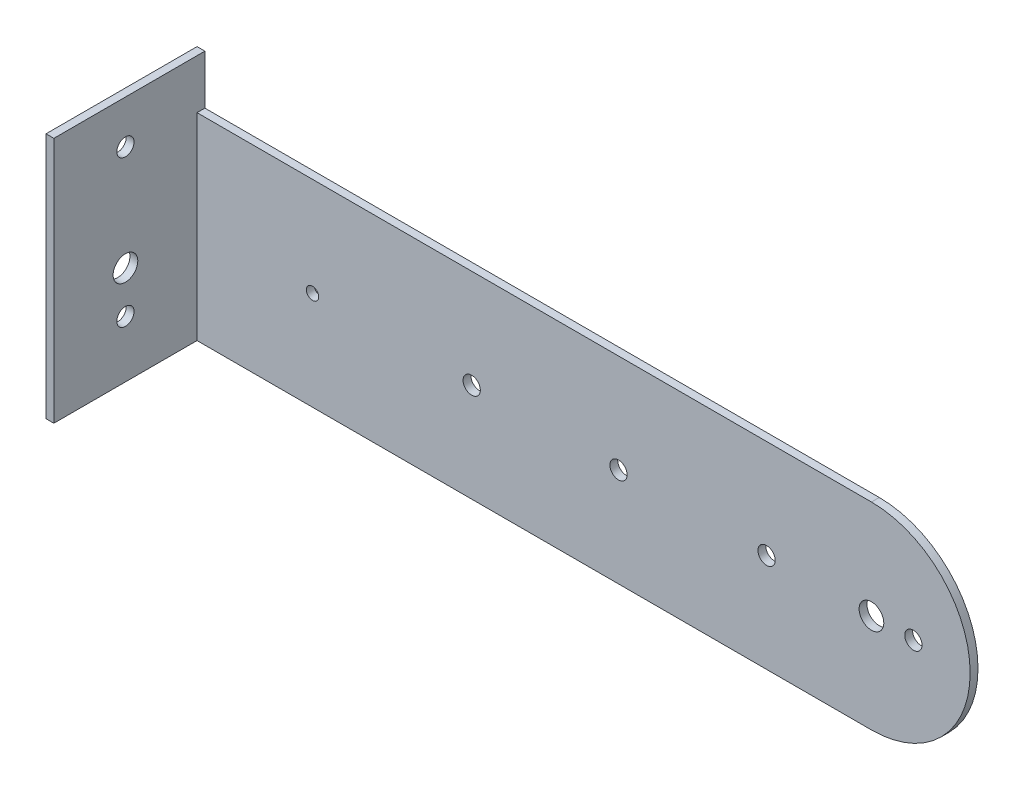
ISO-10303-21;
HEADER;
FILE_DESCRIPTION(('STEP AP214'),'2;1');
FILE_NAME('part.step','',(''),(''),'','','');
FILE_SCHEMA(('AUTOMOTIVE_DESIGN { 1 0 10303 214 1 1 1 1 }'));
ENDSEC;
DATA;
#1=APPLICATION_CONTEXT('core data for automotive mechanical design processes');
#2=APPLICATION_PROTOCOL_DEFINITION('international standard','automotive_design',2000,#1);
#3=PRODUCT_CONTEXT('',#1,'mechanical');
#4=PRODUCT('Part','Part','',(#3));
#5=PRODUCT_RELATED_PRODUCT_CATEGORY('part','',(#4));
#6=PRODUCT_DEFINITION_FORMATION('','',#4);
#7=PRODUCT_DEFINITION_CONTEXT('part definition',#1,'design');
#8=PRODUCT_DEFINITION('design','',#6,#7);
#9=PRODUCT_DEFINITION_SHAPE('','',#8);
#10=(LENGTH_UNIT() NAMED_UNIT(*) SI_UNIT(.MILLI.,.METRE.));
#11=(NAMED_UNIT(*) PLANE_ANGLE_UNIT() SI_UNIT($,.RADIAN.));
#12=(NAMED_UNIT(*) SI_UNIT($,.STERADIAN.) SOLID_ANGLE_UNIT());
#13=UNCERTAINTY_MEASURE_WITH_UNIT(LENGTH_MEASURE(1.E-05),#10,'distance_accuracy_value','');
#14=(GEOMETRIC_REPRESENTATION_CONTEXT(3) GLOBAL_UNCERTAINTY_ASSIGNED_CONTEXT((#13)) GLOBAL_UNIT_ASSIGNED_CONTEXT((#10,
#11,#12)) REPRESENTATION_CONTEXT('',''));
#15=CARTESIAN_POINT('',(0.,0.,0.));
#16=DIRECTION('',(0.,0.,1.));
#17=DIRECTION('',(1.,0.,0.));
#18=AXIS2_PLACEMENT_3D('',#15,#16,#17);
#19=CARTESIAN_POINT('',(-38.5140352366991,20.,1.59));
#20=DIRECTION('',(0.,-1.,0.));
#21=DIRECTION('',(0.,0.,-1.));
#22=AXIS2_PLACEMENT_3D('',#19,#20,#21);
#23=PLANE('',#22);
#24=DIRECTION('',(0.,0.,-1.));
#25=VECTOR('',#24,1.);
#26=CARTESIAN_POINT('',(-98.1399647633009,20.,0.));
#27=LINE('',#26,#25);
#28=CARTESIAN_POINT('',(-98.1399647633009,20.,1.59));
#29=VERTEX_POINT('',#28);
#30=CARTESIAN_POINT('',(-98.1399647633009,20.,0.));
#31=VERTEX_POINT('',#30);
#32=EDGE_CURVE('E99',#29,#31,#27,.T.);
#33=ORIENTED_EDGE('',*,*,#32,.F.);
#34=DIRECTION('',(-1.,0.,0.));
#35=VECTOR('',#34,1.);
#36=CARTESIAN_POINT('',(-38.5140352366991,20.,1.59));
#37=LINE('',#36,#35);
#38=CARTESIAN_POINT('',(38.5140352366991,20.,1.59));
#39=VERTEX_POINT('',#38);
#40=EDGE_CURVE('E164',#39,#29,#37,.T.);
#41=ORIENTED_EDGE('',*,*,#40,.F.);
#42=DIRECTION('',(0.,0.,-1.));
#43=VECTOR('',#42,1.);
#44=CARTESIAN_POINT('',(38.5140352366991,20.,1.59));
#45=LINE('',#44,#43);
#46=CARTESIAN_POINT('',(38.5140352366991,20.,0.));
#47=VERTEX_POINT('',#46);
#48=EDGE_CURVE('E167',#39,#47,#45,.T.);
#49=ORIENTED_EDGE('',*,*,#48,.T.);
#50=DIRECTION('',(-1.,0.,0.));
#51=VECTOR('',#50,1.);
#52=CARTESIAN_POINT('',(-38.5140352366991,20.,0.));
#53=LINE('',#52,#51);
#54=EDGE_CURVE('E162',#47,#31,#53,.T.);
#55=ORIENTED_EDGE('',*,*,#54,.T.);
#56=EDGE_LOOP('',(#33,#41,#49,#55));
#57=FACE_BOUND('',#56,.T.);
#58=ADVANCED_FACE('F33',(#57),#23,.F.);
#59=CARTESIAN_POINT('',(-99.7299647633009,20.,1.59));
#60=DIRECTION('',(1.,0.,0.));
#61=DIRECTION('',(0.,0.,-1.));
#62=AXIS2_PLACEMENT_3D('',#59,#60,#61);
#63=PLANE('',#62);
#64=CARTESIAN_POINT('',(-99.7299647633009,0.,16.096));
#65=DIRECTION('',(-1.,0.,0.));
#66=DIRECTION('',(0.,0.,1.));
#67=AXIS2_PLACEMENT_3D('',#64,#65,#66);
#68=CIRCLE('',#67,2.5);
#69=CARTESIAN_POINT('',(-99.7299647633009,0.,18.596));
#70=VERTEX_POINT('',#69);
#71=EDGE_CURVE('E185',#70,#70,#68,.T.);
#72=ORIENTED_EDGE('',*,*,#71,.F.);
#73=EDGE_LOOP('',(#72));
#74=FACE_BOUND('',#73,.T.);
#75=CARTESIAN_POINT('',(-99.7299647633009,21.25,16.096));
#76=DIRECTION('',(-1.,0.,0.));
#77=DIRECTION('',(0.,0.,1.));
#78=AXIS2_PLACEMENT_3D('',#75,#76,#77);
#79=CIRCLE('',#78,1.75);
#80=CARTESIAN_POINT('',(-99.7299647633009,21.25,17.846));
#81=VERTEX_POINT('',#80);
#82=EDGE_CURVE('E194',#81,#81,#79,.T.);
#83=ORIENTED_EDGE('',*,*,#82,.F.);
#84=EDGE_LOOP('',(#83));
#85=FACE_BOUND('',#84,.T.);
#86=CARTESIAN_POINT('',(-99.7299647633009,-8.5,16.096));
#87=DIRECTION('',(-1.,0.,0.));
#88=DIRECTION('',(0.,0.,1.));
#89=AXIS2_PLACEMENT_3D('',#86,#87,#88);
#90=CIRCLE('',#89,1.75);
#91=CARTESIAN_POINT('',(-99.7299647633009,-8.5,17.846));
#92=VERTEX_POINT('',#91);
#93=EDGE_CURVE('E115',#92,#92,#90,.T.);
#94=ORIENTED_EDGE('',*,*,#93,.F.);
#95=EDGE_LOOP('',(#94));
#96=FACE_BOUND('',#95,.T.);
#97=DIRECTION('',(0.,0.,-1.));
#98=VECTOR('',#97,1.);
#99=CARTESIAN_POINT('',(-99.7299647633009,-20.,1.59));
#100=LINE('',#99,#98);
#101=CARTESIAN_POINT('',(-99.7299647633009,-20.,30.602));
#102=VERTEX_POINT('',#101);
#103=CARTESIAN_POINT('',(-99.7299647633009,-20.,0.));
#104=VERTEX_POINT('',#103);
#105=EDGE_CURVE('E42',#102,#104,#100,.T.);
#106=ORIENTED_EDGE('',*,*,#105,.F.);
#107=DIRECTION('',(0.,-1.,0.));
#108=VECTOR('',#107,1.);
#109=CARTESIAN_POINT('',(-99.7299647633009,20.,30.602));
#110=LINE('',#109,#108);
#111=CARTESIAN_POINT('',(-99.7299647633009,30.,30.602));
#112=VERTEX_POINT('',#111);
#113=EDGE_CURVE('E94',#112,#102,#110,.T.);
#114=ORIENTED_EDGE('',*,*,#113,.F.);
#115=DIRECTION('',(0.,0.,-1.));
#116=VECTOR('',#115,1.);
#117=CARTESIAN_POINT('',(-99.7299647633009,30.,0.));
#118=LINE('',#117,#116);
#119=CARTESIAN_POINT('',(-99.7299647633009,30.,0.));
#120=VERTEX_POINT('',#119);
#121=EDGE_CURVE('E98',#112,#120,#118,.T.);
#122=ORIENTED_EDGE('',*,*,#121,.T.);
#123=DIRECTION('',(0.,-1.,0.));
#124=VECTOR('',#123,1.);
#125=CARTESIAN_POINT('',(-99.7299647633009,20.,0.));
#126=LINE('',#125,#124);
#127=EDGE_CURVE('E156',#120,#104,#126,.T.);
#128=ORIENTED_EDGE('',*,*,#127,.T.);
#129=EDGE_LOOP('',(#106,#114,#122,#128));
#130=FACE_BOUND('',#129,.T.);
#131=ADVANCED_FACE('F35',(#74,#85,#96,#130),#63,.F.);
#132=CARTESIAN_POINT('',(-38.5140352366991,-20.,1.59));
#133=DIRECTION('',(0.,1.,0.));
#134=DIRECTION('',(0.,0.,1.));
#135=AXIS2_PLACEMENT_3D('',#132,#133,#134);
#136=PLANE('',#135);
#137=DIRECTION('',(0.,0.,-1.));
#138=VECTOR('',#137,1.);
#139=CARTESIAN_POINT('',(-98.1399647633009,-20.,32.192));
#140=LINE('',#139,#138);
#141=CARTESIAN_POINT('',(-98.1399647633009,-20.,30.602));
#142=VERTEX_POINT('',#141);
#143=CARTESIAN_POINT('',(-98.1399647633009,-20.,1.59));
#144=VERTEX_POINT('',#143);
#145=EDGE_CURVE('E56',#142,#144,#140,.T.);
#146=ORIENTED_EDGE('',*,*,#145,.F.);
#147=DIRECTION('',(-1.,0.,0.));
#148=VECTOR('',#147,1.);
#149=CARTESIAN_POINT('',(-89.7299647633009,-20.,30.602));
#150=LINE('',#149,#148);
#151=EDGE_CURVE('E50',#142,#102,#150,.T.);
#152=ORIENTED_EDGE('',*,*,#151,.T.);
#153=ORIENTED_EDGE('',*,*,#105,.T.);
#154=DIRECTION('',(1.,0.,0.));
#155=VECTOR('',#154,1.);
#156=CARTESIAN_POINT('',(-38.5140352366991,-20.,0.));
#157=LINE('',#156,#155);
#158=CARTESIAN_POINT('',(38.5140352366991,-20.,0.));
#159=VERTEX_POINT('',#158);
#160=EDGE_CURVE('E169',#104,#159,#157,.T.);
#161=ORIENTED_EDGE('',*,*,#160,.T.);
#162=DIRECTION('',(0.,0.,-1.));
#163=VECTOR('',#162,1.);
#164=CARTESIAN_POINT('',(38.5140352366991,-20.,1.59));
#165=LINE('',#164,#163);
#166=CARTESIAN_POINT('',(38.5140352366991,-20.,1.59));
#167=VERTEX_POINT('',#166);
#168=EDGE_CURVE('E178',#167,#159,#165,.T.);
#169=ORIENTED_EDGE('',*,*,#168,.F.);
#170=DIRECTION('',(1.,0.,0.));
#171=VECTOR('',#170,1.);
#172=CARTESIAN_POINT('',(-99.7299647633009,-20.,1.59));
#173=LINE('',#172,#171);
#174=EDGE_CURVE('E159',#144,#167,#173,.T.);
#175=ORIENTED_EDGE('',*,*,#174,.F.);
#176=EDGE_LOOP('',(#146,#152,#153,#161,#169,#175));
#177=FACE_BOUND('',#176,.T.);
#178=ADVANCED_FACE('F204',(#177),#136,.F.);
#179=CARTESIAN_POINT('',(38.5140352366991,0.,1.59));
#180=DIRECTION('',(0.,0.,-1.));
#181=DIRECTION('',(-1.,0.,0.));
#182=AXIS2_PLACEMENT_3D('',#179,#180,#181);
#183=CYLINDRICAL_SURFACE('',#182,20.);
#184=CARTESIAN_POINT('',(38.5140352366991,0.,0.));
#185=DIRECTION('',(0.,0.,1.));
#186=DIRECTION('',(1.,0.,0.));
#187=AXIS2_PLACEMENT_3D('',#184,#185,#186);
#188=CIRCLE('',#187,20.);
#189=EDGE_CURVE('E171',#159,#47,#188,.T.);
#190=ORIENTED_EDGE('',*,*,#189,.T.);
#191=ORIENTED_EDGE('',*,*,#48,.F.);
#192=CARTESIAN_POINT('',(38.5140352366991,0.,1.59));
#193=DIRECTION('',(0.,0.,1.));
#194=DIRECTION('',(1.,0.,0.));
#195=AXIS2_PLACEMENT_3D('',#192,#193,#194);
#196=CIRCLE('',#195,20.);
#197=EDGE_CURVE('E161',#167,#39,#196,.T.);
#198=ORIENTED_EDGE('',*,*,#197,.F.);
#199=ORIENTED_EDGE('',*,*,#168,.T.);
#200=EDGE_LOOP('',(#190,#191,#198,#199));
#201=FACE_BOUND('',#200,.T.);
#202=ADVANCED_FACE('F208',(#201),#183,.T.);
#203=CARTESIAN_POINT('',(38.5140352366991,0.,1.59));
#204=DIRECTION('',(0.,0.,1.));
#205=DIRECTION('',(1.,0.,0.));
#206=AXIS2_PLACEMENT_3D('',#203,#204,#205);
#207=PLANE('',#206);
#208=CARTESIAN_POINT('',(-74.7299647633009,0.,1.59));
#209=DIRECTION('',(0.,0.,1.));
#210=DIRECTION('',(1.,0.,0.));
#211=AXIS2_PLACEMENT_3D('',#208,#209,#210);
#212=CIRCLE('',#211,1.25);
#213=CARTESIAN_POINT('',(-73.4799647633009,0.,1.59));
#214=VERTEX_POINT('',#213);
#215=EDGE_CURVE('E407',#214,#214,#212,.T.);
#216=ORIENTED_EDGE('',*,*,#215,.F.);
#217=EDGE_LOOP('',(#216));
#218=FACE_BOUND('',#217,.T.);
#219=DIRECTION('',(0.,1.,0.));
#220=VECTOR('',#219,1.);
#221=CARTESIAN_POINT('',(-98.1399647633009,20.,1.59));
#222=LINE('',#221,#220);
#223=EDGE_CURVE('E125',#144,#29,#222,.T.);
#224=ORIENTED_EDGE('',*,*,#223,.F.);
#225=ORIENTED_EDGE('',*,*,#174,.T.);
#226=ORIENTED_EDGE('',*,*,#197,.T.);
#227=ORIENTED_EDGE('',*,*,#40,.T.);
#228=EDGE_LOOP('',(#224,#225,#226,#227));
#229=FACE_BOUND('',#228,.T.);
#230=CARTESIAN_POINT('',(47.0140352366991,0.,1.59));
#231=DIRECTION('',(0.,0.,1.));
#232=DIRECTION('',(1.,0.,0.));
#233=AXIS2_PLACEMENT_3D('',#230,#231,#232);
#234=CIRCLE('',#233,1.74999999999999);
#235=CARTESIAN_POINT('',(48.7640352366991,0.,1.59));
#236=VERTEX_POINT('',#235);
#237=EDGE_CURVE('E133',#236,#236,#234,.T.);
#238=ORIENTED_EDGE('',*,*,#237,.F.);
#239=EDGE_LOOP('',(#238));
#240=FACE_BOUND('',#239,.T.);
#241=CARTESIAN_POINT('',(17.2640352366991,0.,1.59));
#242=DIRECTION('',(0.,0.,1.));
#243=DIRECTION('',(1.,0.,0.));
#244=AXIS2_PLACEMENT_3D('',#241,#242,#243);
#245=CIRCLE('',#244,1.75);
#246=CARTESIAN_POINT('',(19.0140352366991,0.,1.59));
#247=VERTEX_POINT('',#246);
#248=EDGE_CURVE('E139',#247,#247,#245,.T.);
#249=ORIENTED_EDGE('',*,*,#248,.F.);
#250=EDGE_LOOP('',(#249));
#251=FACE_BOUND('',#250,.T.);
#252=CARTESIAN_POINT('',(-12.7359647633009,0.,1.59));
#253=DIRECTION('',(0.,0.,1.));
#254=DIRECTION('',(-1.,0.,0.));
#255=AXIS2_PLACEMENT_3D('',#252,#253,#254);
#256=CIRCLE('',#255,1.75);
#257=CARTESIAN_POINT('',(-10.9859647633009,0.,1.59));
#258=VERTEX_POINT('',#257);
#259=EDGE_CURVE('E145',#258,#258,#256,.T.);
#260=ORIENTED_EDGE('',*,*,#259,.F.);
#261=EDGE_LOOP('',(#260));
#262=FACE_BOUND('',#261,.T.);
#263=CARTESIAN_POINT('',(-42.4859647633009,0.,1.59));
#264=DIRECTION('',(0.,0.,1.));
#265=DIRECTION('',(-1.,0.,0.));
#266=AXIS2_PLACEMENT_3D('',#263,#264,#265);
#267=CIRCLE('',#266,1.75);
#268=CARTESIAN_POINT('',(-40.7359647633009,0.,1.59));
#269=VERTEX_POINT('',#268);
#270=EDGE_CURVE('E128',#269,#269,#267,.T.);
#271=ORIENTED_EDGE('',*,*,#270,.F.);
#272=EDGE_LOOP('',(#271));
#273=FACE_BOUND('',#272,.T.);
#274=CARTESIAN_POINT('',(38.5140352366991,0.,1.59));
#275=DIRECTION('',(0.,0.,1.));
#276=DIRECTION('',(1.,0.,0.));
#277=AXIS2_PLACEMENT_3D('',#274,#275,#276);
#278=CIRCLE('',#277,2.49999999999999);
#279=CARTESIAN_POINT('',(41.0140352366991,0.,1.59));
#280=VERTEX_POINT('',#279);
#281=EDGE_CURVE('E132',#280,#280,#278,.T.);
#282=ORIENTED_EDGE('',*,*,#281,.F.);
#283=EDGE_LOOP('',(#282));
#284=FACE_BOUND('',#283,.T.);
#285=ADVANCED_FACE('F212',(#218,#229,#240,#251,#262,#273,#284),#207,.T.);
#286=CARTESIAN_POINT('',(38.5140352366991,0.,0.));
#287=DIRECTION('',(0.,0.,1.));
#288=DIRECTION('',(1.,0.,0.));
#289=AXIS2_PLACEMENT_3D('',#286,#287,#288);
#290=PLANE('',#289);
#291=CARTESIAN_POINT('',(-74.7299647633009,0.,0.));
#292=DIRECTION('',(0.,0.,1.));
#293=DIRECTION('',(1.,0.,0.));
#294=AXIS2_PLACEMENT_3D('',#291,#292,#293);
#295=CIRCLE('',#294,1.25);
#296=CARTESIAN_POINT('',(-73.4799647633009,0.,0.));
#297=VERTEX_POINT('',#296);
#298=EDGE_CURVE('E37',#297,#297,#295,.T.);
#299=ORIENTED_EDGE('',*,*,#298,.T.);
#300=EDGE_LOOP('',(#299));
#301=FACE_BOUND('',#300,.T.);
#302=CARTESIAN_POINT('',(47.0140352366991,0.,0.));
#303=DIRECTION('',(0.,0.,1.));
#304=DIRECTION('',(1.,0.,0.));
#305=AXIS2_PLACEMENT_3D('',#302,#303,#304);
#306=CIRCLE('',#305,1.74999999999999);
#307=CARTESIAN_POINT('',(48.7640352366991,0.,0.));
#308=VERTEX_POINT('',#307);
#309=EDGE_CURVE('E129',#308,#308,#306,.T.);
#310=ORIENTED_EDGE('',*,*,#309,.T.);
#311=EDGE_LOOP('',(#310));
#312=FACE_BOUND('',#311,.T.);
#313=CARTESIAN_POINT('',(17.2640352366991,0.,0.));
#314=DIRECTION('',(0.,0.,1.));
#315=DIRECTION('',(1.,0.,0.));
#316=AXIS2_PLACEMENT_3D('',#313,#314,#315);
#317=CIRCLE('',#316,1.75);
#318=CARTESIAN_POINT('',(19.0140352366991,0.,0.));
#319=VERTEX_POINT('',#318);
#320=EDGE_CURVE('E136',#319,#319,#317,.T.);
#321=ORIENTED_EDGE('',*,*,#320,.T.);
#322=EDGE_LOOP('',(#321));
#323=FACE_BOUND('',#322,.T.);
#324=CARTESIAN_POINT('',(-12.7359647633009,0.,0.));
#325=DIRECTION('',(0.,0.,1.));
#326=DIRECTION('',(-1.,0.,0.));
#327=AXIS2_PLACEMENT_3D('',#324,#325,#326);
#328=CIRCLE('',#327,1.75);
#329=CARTESIAN_POINT('',(-10.9859647633009,0.,0.));
#330=VERTEX_POINT('',#329);
#331=EDGE_CURVE('E142',#330,#330,#328,.T.);
#332=ORIENTED_EDGE('',*,*,#331,.T.);
#333=EDGE_LOOP('',(#332));
#334=FACE_BOUND('',#333,.T.);
#335=CARTESIAN_POINT('',(-42.4859647633009,0.,0.));
#336=DIRECTION('',(0.,0.,1.));
#337=DIRECTION('',(-1.,0.,0.));
#338=AXIS2_PLACEMENT_3D('',#335,#336,#337);
#339=CIRCLE('',#338,1.75);
#340=CARTESIAN_POINT('',(-40.7359647633009,0.,0.));
#341=VERTEX_POINT('',#340);
#342=EDGE_CURVE('E148',#341,#341,#339,.T.);
#343=ORIENTED_EDGE('',*,*,#342,.T.);
#344=EDGE_LOOP('',(#343));
#345=FACE_BOUND('',#344,.T.);
#346=CARTESIAN_POINT('',(38.5140352366991,0.,0.));
#347=DIRECTION('',(0.,0.,1.));
#348=DIRECTION('',(1.,0.,0.));
#349=AXIS2_PLACEMENT_3D('',#346,#347,#348);
#350=CIRCLE('',#349,2.49999999999999);
#351=CARTESIAN_POINT('',(41.0140352366991,0.,0.));
#352=VERTEX_POINT('',#351);
#353=EDGE_CURVE('E153',#352,#352,#350,.T.);
#354=ORIENTED_EDGE('',*,*,#353,.T.);
#355=EDGE_LOOP('',(#354));
#356=FACE_BOUND('',#355,.T.);
#357=ORIENTED_EDGE('',*,*,#127,.F.);
#358=DIRECTION('',(-1.,0.,0.));
#359=VECTOR('',#358,1.);
#360=CARTESIAN_POINT('',(-65.9455179750736,30.,0.));
#361=LINE('',#360,#359);
#362=CARTESIAN_POINT('',(-98.1399647633009,30.,0.));
#363=VERTEX_POINT('',#362);
#364=EDGE_CURVE('E107',#363,#120,#361,.T.);
#365=ORIENTED_EDGE('',*,*,#364,.F.);
#366=DIRECTION('',(0.,1.,0.));
#367=VECTOR('',#366,1.);
#368=CARTESIAN_POINT('',(-98.1399647633009,20.,0.));
#369=LINE('',#368,#367);
#370=EDGE_CURVE('E119',#31,#363,#369,.T.);
#371=ORIENTED_EDGE('',*,*,#370,.F.);
#372=ORIENTED_EDGE('',*,*,#54,.F.);
#373=ORIENTED_EDGE('',*,*,#189,.F.);
#374=ORIENTED_EDGE('',*,*,#160,.F.);
#375=EDGE_LOOP('',(#357,#365,#371,#372,#373,#374));
#376=FACE_BOUND('',#375,.T.);
#377=ADVANCED_FACE('F199',(#301,#312,#323,#334,#345,#356,#376),#290,.F.);
#378=CARTESIAN_POINT('',(38.5140352366991,0.,0.));
#379=DIRECTION('',(0.,0.,1.));
#380=DIRECTION('',(1.,0.,0.));
#381=AXIS2_PLACEMENT_3D('',#378,#379,#380);
#382=CYLINDRICAL_SURFACE('',#381,2.49999999999999);
#383=CARTESIAN_POINT('',(41.0140352366991,0.,0.));
#384=CARTESIAN_POINT('',(41.0140352366991,0.,0.0165625));
#385=CARTESIAN_POINT('',(41.0140352366991,0.,0.033125));
#386=CARTESIAN_POINT('',(41.0140352366991,0.,0.06625));
#387=CARTESIAN_POINT('',(41.0140352366991,0.,0.0828125));
#388=CARTESIAN_POINT('',(41.0140352366991,0.,0.1159375));
#389=CARTESIAN_POINT('',(41.0140352366991,0.,0.1325));
#390=CARTESIAN_POINT('',(41.0140352366991,0.,0.165625));
#391=CARTESIAN_POINT('',(41.0140352366991,0.,0.1821875));
#392=CARTESIAN_POINT('',(41.0140352366991,0.,0.2153125));
#393=CARTESIAN_POINT('',(41.0140352366991,0.,0.231875));
#394=CARTESIAN_POINT('',(41.0140352366991,0.,0.265));
#395=CARTESIAN_POINT('',(41.0140352366991,0.,0.2815625));
#396=CARTESIAN_POINT('',(41.0140352366991,0.,0.3146875));
#397=CARTESIAN_POINT('',(41.0140352366991,0.,0.33125));
#398=CARTESIAN_POINT('',(41.0140352366991,0.,0.364375));
#399=CARTESIAN_POINT('',(41.0140352366991,0.,0.3809375));
#400=CARTESIAN_POINT('',(41.0140352366991,0.,0.4140625));
#401=CARTESIAN_POINT('',(41.0140352366991,0.,0.430625));
#402=CARTESIAN_POINT('',(41.0140352366991,0.,0.46375));
#403=CARTESIAN_POINT('',(41.0140352366991,0.,0.4803125));
#404=CARTESIAN_POINT('',(41.0140352366991,0.,0.5134375));
#405=CARTESIAN_POINT('',(41.0140352366991,0.,0.53));
#406=CARTESIAN_POINT('',(41.0140352366991,0.,0.563125));
#407=CARTESIAN_POINT('',(41.0140352366991,0.,0.5796875));
#408=CARTESIAN_POINT('',(41.0140352366991,0.,0.6128125));
#409=CARTESIAN_POINT('',(41.0140352366991,0.,0.629375));
#410=CARTESIAN_POINT('',(41.0140352366991,0.,0.6625));
#411=CARTESIAN_POINT('',(41.0140352366991,0.,0.6790625));
#412=CARTESIAN_POINT('',(41.0140352366991,0.,0.7121875));
#413=CARTESIAN_POINT('',(41.0140352366991,0.,0.72875));
#414=CARTESIAN_POINT('',(41.0140352366991,0.,0.761875));
#415=CARTESIAN_POINT('',(41.0140352366991,0.,0.7784375));
#416=CARTESIAN_POINT('',(41.0140352366991,0.,0.8115625));
#417=CARTESIAN_POINT('',(41.0140352366991,0.,0.828125));
#418=CARTESIAN_POINT('',(41.0140352366991,0.,0.86125));
#419=CARTESIAN_POINT('',(41.0140352366991,0.,0.8778125));
#420=CARTESIAN_POINT('',(41.0140352366991,0.,0.9109375));
#421=CARTESIAN_POINT('',(41.0140352366991,0.,0.9275));
#422=CARTESIAN_POINT('',(41.0140352366991,0.,0.960625));
#423=CARTESIAN_POINT('',(41.0140352366991,0.,0.9771875));
#424=CARTESIAN_POINT('',(41.0140352366991,0.,1.0103125));
#425=CARTESIAN_POINT('',(41.0140352366991,0.,1.026875));
#426=CARTESIAN_POINT('',(41.0140352366991,0.,1.06));
#427=CARTESIAN_POINT('',(41.0140352366991,0.,1.0765625));
#428=CARTESIAN_POINT('',(41.0140352366991,0.,1.1096875));
#429=CARTESIAN_POINT('',(41.0140352366991,0.,1.12625));
#430=CARTESIAN_POINT('',(41.0140352366991,0.,1.159375));
#431=CARTESIAN_POINT('',(41.0140352366991,0.,1.1759375));
#432=CARTESIAN_POINT('',(41.0140352366991,0.,1.2090625));
#433=CARTESIAN_POINT('',(41.0140352366991,0.,1.225625));
#434=CARTESIAN_POINT('',(41.0140352366991,0.,1.25875));
#435=CARTESIAN_POINT('',(41.0140352366991,0.,1.2753125));
#436=CARTESIAN_POINT('',(41.0140352366991,0.,1.3084375));
#437=CARTESIAN_POINT('',(41.0140352366991,0.,1.325));
#438=CARTESIAN_POINT('',(41.0140352366991,0.,1.358125));
#439=CARTESIAN_POINT('',(41.0140352366991,0.,1.3746875));
#440=CARTESIAN_POINT('',(41.0140352366991,0.,1.4078125));
#441=CARTESIAN_POINT('',(41.0140352366991,0.,1.424375));
#442=CARTESIAN_POINT('',(41.0140352366991,0.,1.4575));
#443=CARTESIAN_POINT('',(41.0140352366991,0.,1.4740625));
#444=CARTESIAN_POINT('',(41.0140352366991,0.,1.5071875));
#445=CARTESIAN_POINT('',(41.0140352366991,0.,1.52375));
#446=CARTESIAN_POINT('',(41.0140352366991,0.,1.556875));
#447=CARTESIAN_POINT('',(41.0140352366991,0.,1.5734375));
#448=CARTESIAN_POINT('',(41.0140352366991,0.,1.59));
#449=B_SPLINE_CURVE_WITH_KNOTS('',3,(#383,#384,#385,#386,#387,#388,#389,#390,#391,#392,#393,
#394,#395,#396,#397,#398,#399,#400,#401,#402,#403,#404,#405,#406,#407,#408,#409,#410,#411,#412,
#413,#414,#415,#416,#417,#418,#419,#420,#421,#422,#423,#424,#425,#426,#427,#428,#429,#430,#431,
#432,#433,#434,#435,#436,#437,#438,#439,#440,#441,#442,#443,#444,#445,#446,#447,#448),
.UNSPECIFIED.,.F.,.F.,(4,2,2,2,2,2,2,2,2,2,2,2,2,2,2,2,2,2,2,2,2,2,2,2,2,2,2,2,2,2,2,2,4),(0.,
0.0496875,0.099375,0.1490625,0.19875,0.2484375,0.298125,0.3478125,0.3975,0.4471875,0.496875,
0.5465625,0.59625,0.6459375,0.695625,0.7453125,0.795,0.8446875,0.894375,0.9440625,0.99375,
1.0434375,1.093125,1.1428125,1.1925,1.2421875,1.291875,1.3415625,1.39125,1.4409375,1.490625,
1.5403125,1.59),.UNSPECIFIED.);
#450=EDGE_CURVE('BSEAM249',#352,#280,#449,.T.);
#451=ORIENTED_EDGE('',*,*,#353,.F.);
#452=ORIENTED_EDGE('',*,*,#281,.T.);
#453=ORIENTED_EDGE('',*,*,#450,.T.);
#454=ORIENTED_EDGE('',*,*,#450,.F.);
#455=EDGE_LOOP('',(#451,#453,#452,#454));
#456=FACE_BOUND('',#455,.T.);
#457=ADVANCED_FACE('F249',(#456),#382,.F.);
#458=CARTESIAN_POINT('',(-42.4859647633009,0.,0.));
#459=DIRECTION('',(0.,0.,1.));
#460=DIRECTION('',(1.,0.,0.));
#461=AXIS2_PLACEMENT_3D('',#458,#459,#460);
#462=CYLINDRICAL_SURFACE('',#461,1.75);
#463=CARTESIAN_POINT('',(-40.7359647633009,0.,0.));
#464=CARTESIAN_POINT('',(-40.7359647633009,0.,0.0165625));
#465=CARTESIAN_POINT('',(-40.7359647633009,0.,0.033125));
#466=CARTESIAN_POINT('',(-40.7359647633009,0.,0.06625));
#467=CARTESIAN_POINT('',(-40.7359647633009,0.,0.0828125));
#468=CARTESIAN_POINT('',(-40.7359647633009,0.,0.1159375));
#469=CARTESIAN_POINT('',(-40.7359647633009,0.,0.1325));
#470=CARTESIAN_POINT('',(-40.7359647633009,0.,0.165625));
#471=CARTESIAN_POINT('',(-40.7359647633009,0.,0.1821875));
#472=CARTESIAN_POINT('',(-40.7359647633009,0.,0.2153125));
#473=CARTESIAN_POINT('',(-40.7359647633009,0.,0.231875));
#474=CARTESIAN_POINT('',(-40.7359647633009,0.,0.265));
#475=CARTESIAN_POINT('',(-40.7359647633009,0.,0.2815625));
#476=CARTESIAN_POINT('',(-40.7359647633009,0.,0.3146875));
#477=CARTESIAN_POINT('',(-40.7359647633009,0.,0.33125));
#478=CARTESIAN_POINT('',(-40.7359647633009,0.,0.364375));
#479=CARTESIAN_POINT('',(-40.7359647633009,0.,0.3809375));
#480=CARTESIAN_POINT('',(-40.7359647633009,0.,0.4140625));
#481=CARTESIAN_POINT('',(-40.7359647633009,0.,0.430625));
#482=CARTESIAN_POINT('',(-40.7359647633009,0.,0.46375));
#483=CARTESIAN_POINT('',(-40.7359647633009,0.,0.4803125));
#484=CARTESIAN_POINT('',(-40.7359647633009,0.,0.5134375));
#485=CARTESIAN_POINT('',(-40.7359647633009,0.,0.53));
#486=CARTESIAN_POINT('',(-40.7359647633009,0.,0.563125));
#487=CARTESIAN_POINT('',(-40.7359647633009,0.,0.5796875));
#488=CARTESIAN_POINT('',(-40.7359647633009,0.,0.6128125));
#489=CARTESIAN_POINT('',(-40.7359647633009,0.,0.629375));
#490=CARTESIAN_POINT('',(-40.7359647633009,0.,0.6625));
#491=CARTESIAN_POINT('',(-40.7359647633009,0.,0.6790625));
#492=CARTESIAN_POINT('',(-40.7359647633009,0.,0.7121875));
#493=CARTESIAN_POINT('',(-40.7359647633009,0.,0.72875));
#494=CARTESIAN_POINT('',(-40.7359647633009,0.,0.761875));
#495=CARTESIAN_POINT('',(-40.7359647633009,0.,0.7784375));
#496=CARTESIAN_POINT('',(-40.7359647633009,0.,0.8115625));
#497=CARTESIAN_POINT('',(-40.7359647633009,0.,0.828125));
#498=CARTESIAN_POINT('',(-40.7359647633009,0.,0.86125));
#499=CARTESIAN_POINT('',(-40.7359647633009,0.,0.8778125));
#500=CARTESIAN_POINT('',(-40.7359647633009,0.,0.9109375));
#501=CARTESIAN_POINT('',(-40.7359647633009,0.,0.9275));
#502=CARTESIAN_POINT('',(-40.7359647633009,0.,0.960625));
#503=CARTESIAN_POINT('',(-40.7359647633009,0.,0.9771875));
#504=CARTESIAN_POINT('',(-40.7359647633009,0.,1.0103125));
#505=CARTESIAN_POINT('',(-40.7359647633009,0.,1.026875));
#506=CARTESIAN_POINT('',(-40.7359647633009,0.,1.06));
#507=CARTESIAN_POINT('',(-40.7359647633009,0.,1.0765625));
#508=CARTESIAN_POINT('',(-40.7359647633009,0.,1.1096875));
#509=CARTESIAN_POINT('',(-40.7359647633009,0.,1.12625));
#510=CARTESIAN_POINT('',(-40.7359647633009,0.,1.159375));
#511=CARTESIAN_POINT('',(-40.7359647633009,0.,1.1759375));
#512=CARTESIAN_POINT('',(-40.7359647633009,0.,1.2090625));
#513=CARTESIAN_POINT('',(-40.7359647633009,0.,1.225625));
#514=CARTESIAN_POINT('',(-40.7359647633009,0.,1.25875));
#515=CARTESIAN_POINT('',(-40.7359647633009,0.,1.2753125));
#516=CARTESIAN_POINT('',(-40.7359647633009,0.,1.3084375));
#517=CARTESIAN_POINT('',(-40.7359647633009,0.,1.325));
#518=CARTESIAN_POINT('',(-40.7359647633009,0.,1.358125));
#519=CARTESIAN_POINT('',(-40.7359647633009,0.,1.3746875));
#520=CARTESIAN_POINT('',(-40.7359647633009,0.,1.4078125));
#521=CARTESIAN_POINT('',(-40.7359647633009,0.,1.424375));
#522=CARTESIAN_POINT('',(-40.7359647633009,0.,1.4575));
#523=CARTESIAN_POINT('',(-40.7359647633009,0.,1.4740625));
#524=CARTESIAN_POINT('',(-40.7359647633009,0.,1.5071875));
#525=CARTESIAN_POINT('',(-40.7359647633009,0.,1.52375));
#526=CARTESIAN_POINT('',(-40.7359647633009,0.,1.556875));
#527=CARTESIAN_POINT('',(-40.7359647633009,0.,1.5734375));
#528=CARTESIAN_POINT('',(-40.7359647633009,0.,1.59));
#529=B_SPLINE_CURVE_WITH_KNOTS('',3,(#463,#464,#465,#466,#467,#468,#469,#470,#471,#472,#473,
#474,#475,#476,#477,#478,#479,#480,#481,#482,#483,#484,#485,#486,#487,#488,#489,#490,#491,#492,
#493,#494,#495,#496,#497,#498,#499,#500,#501,#502,#503,#504,#505,#506,#507,#508,#509,#510,#511,
#512,#513,#514,#515,#516,#517,#518,#519,#520,#521,#522,#523,#524,#525,#526,#527,#528),
.UNSPECIFIED.,.F.,.F.,(4,2,2,2,2,2,2,2,2,2,2,2,2,2,2,2,2,2,2,2,2,2,2,2,2,2,2,2,2,2,2,2,4),(0.,
0.0496875,0.099375,0.1490625,0.19875,0.2484375,0.298125,0.3478125,0.3975,0.4471875,0.496875,
0.5465625,0.59625,0.6459375,0.695625,0.7453125,0.795,0.8446875,0.894375,0.9440625,0.99375,
1.0434375,1.093125,1.1428125,1.1925,1.2421875,1.291875,1.3415625,1.39125,1.4409375,1.490625,
1.5403125,1.59),.UNSPECIFIED.);
#530=EDGE_CURVE('BSEAM256',#341,#269,#529,.T.);
#531=ORIENTED_EDGE('',*,*,#342,.F.);
#532=ORIENTED_EDGE('',*,*,#270,.T.);
#533=ORIENTED_EDGE('',*,*,#530,.T.);
#534=ORIENTED_EDGE('',*,*,#530,.F.);
#535=EDGE_LOOP('',(#531,#533,#532,#534));
#536=FACE_BOUND('',#535,.T.);
#537=ADVANCED_FACE('F256',(#536),#462,.F.);
#538=CARTESIAN_POINT('',(-12.7359647633009,0.,0.));
#539=DIRECTION('',(0.,0.,1.));
#540=DIRECTION('',(1.,0.,0.));
#541=AXIS2_PLACEMENT_3D('',#538,#539,#540);
#542=CYLINDRICAL_SURFACE('',#541,1.75);
#543=CARTESIAN_POINT('',(-10.9859647633009,0.,0.));
#544=CARTESIAN_POINT('',(-10.9859647633009,0.,0.0165625));
#545=CARTESIAN_POINT('',(-10.9859647633009,0.,0.033125));
#546=CARTESIAN_POINT('',(-10.9859647633009,0.,0.06625));
#547=CARTESIAN_POINT('',(-10.9859647633009,0.,0.0828125));
#548=CARTESIAN_POINT('',(-10.9859647633009,0.,0.1159375));
#549=CARTESIAN_POINT('',(-10.9859647633009,0.,0.1325));
#550=CARTESIAN_POINT('',(-10.9859647633009,0.,0.165625));
#551=CARTESIAN_POINT('',(-10.9859647633009,0.,0.1821875));
#552=CARTESIAN_POINT('',(-10.9859647633009,0.,0.2153125));
#553=CARTESIAN_POINT('',(-10.9859647633009,0.,0.231875));
#554=CARTESIAN_POINT('',(-10.9859647633009,0.,0.265));
#555=CARTESIAN_POINT('',(-10.9859647633009,0.,0.2815625));
#556=CARTESIAN_POINT('',(-10.9859647633009,0.,0.3146875));
#557=CARTESIAN_POINT('',(-10.9859647633009,0.,0.33125));
#558=CARTESIAN_POINT('',(-10.9859647633009,0.,0.364375));
#559=CARTESIAN_POINT('',(-10.9859647633009,0.,0.3809375));
#560=CARTESIAN_POINT('',(-10.9859647633009,0.,0.4140625));
#561=CARTESIAN_POINT('',(-10.9859647633009,0.,0.430625));
#562=CARTESIAN_POINT('',(-10.9859647633009,0.,0.46375));
#563=CARTESIAN_POINT('',(-10.9859647633009,0.,0.4803125));
#564=CARTESIAN_POINT('',(-10.9859647633009,0.,0.5134375));
#565=CARTESIAN_POINT('',(-10.9859647633009,0.,0.53));
#566=CARTESIAN_POINT('',(-10.9859647633009,0.,0.563125));
#567=CARTESIAN_POINT('',(-10.9859647633009,0.,0.5796875));
#568=CARTESIAN_POINT('',(-10.9859647633009,0.,0.6128125));
#569=CARTESIAN_POINT('',(-10.9859647633009,0.,0.629375));
#570=CARTESIAN_POINT('',(-10.9859647633009,0.,0.6625));
#571=CARTESIAN_POINT('',(-10.9859647633009,0.,0.6790625));
#572=CARTESIAN_POINT('',(-10.9859647633009,0.,0.7121875));
#573=CARTESIAN_POINT('',(-10.9859647633009,0.,0.72875));
#574=CARTESIAN_POINT('',(-10.9859647633009,0.,0.761875));
#575=CARTESIAN_POINT('',(-10.9859647633009,0.,0.7784375));
#576=CARTESIAN_POINT('',(-10.9859647633009,0.,0.8115625));
#577=CARTESIAN_POINT('',(-10.9859647633009,0.,0.828125));
#578=CARTESIAN_POINT('',(-10.9859647633009,0.,0.86125));
#579=CARTESIAN_POINT('',(-10.9859647633009,0.,0.8778125));
#580=CARTESIAN_POINT('',(-10.9859647633009,0.,0.9109375));
#581=CARTESIAN_POINT('',(-10.9859647633009,0.,0.9275));
#582=CARTESIAN_POINT('',(-10.9859647633009,0.,0.960625));
#583=CARTESIAN_POINT('',(-10.9859647633009,0.,0.9771875));
#584=CARTESIAN_POINT('',(-10.9859647633009,0.,1.0103125));
#585=CARTESIAN_POINT('',(-10.9859647633009,0.,1.026875));
#586=CARTESIAN_POINT('',(-10.9859647633009,0.,1.06));
#587=CARTESIAN_POINT('',(-10.9859647633009,0.,1.0765625));
#588=CARTESIAN_POINT('',(-10.9859647633009,0.,1.1096875));
#589=CARTESIAN_POINT('',(-10.9859647633009,0.,1.12625));
#590=CARTESIAN_POINT('',(-10.9859647633009,0.,1.159375));
#591=CARTESIAN_POINT('',(-10.9859647633009,0.,1.1759375));
#592=CARTESIAN_POINT('',(-10.9859647633009,0.,1.2090625));
#593=CARTESIAN_POINT('',(-10.9859647633009,0.,1.225625));
#594=CARTESIAN_POINT('',(-10.9859647633009,0.,1.25875));
#595=CARTESIAN_POINT('',(-10.9859647633009,0.,1.2753125));
#596=CARTESIAN_POINT('',(-10.9859647633009,0.,1.3084375));
#597=CARTESIAN_POINT('',(-10.9859647633009,0.,1.325));
#598=CARTESIAN_POINT('',(-10.9859647633009,0.,1.358125));
#599=CARTESIAN_POINT('',(-10.9859647633009,0.,1.3746875));
#600=CARTESIAN_POINT('',(-10.9859647633009,0.,1.4078125));
#601=CARTESIAN_POINT('',(-10.9859647633009,0.,1.424375));
#602=CARTESIAN_POINT('',(-10.9859647633009,0.,1.4575));
#603=CARTESIAN_POINT('',(-10.9859647633009,0.,1.4740625));
#604=CARTESIAN_POINT('',(-10.9859647633009,0.,1.5071875));
#605=CARTESIAN_POINT('',(-10.9859647633009,0.,1.52375));
#606=CARTESIAN_POINT('',(-10.9859647633009,0.,1.556875));
#607=CARTESIAN_POINT('',(-10.9859647633009,0.,1.5734375));
#608=CARTESIAN_POINT('',(-10.9859647633009,0.,1.59));
#609=B_SPLINE_CURVE_WITH_KNOTS('',3,(#543,#544,#545,#546,#547,#548,#549,#550,#551,#552,#553,
#554,#555,#556,#557,#558,#559,#560,#561,#562,#563,#564,#565,#566,#567,#568,#569,#570,#571,#572,
#573,#574,#575,#576,#577,#578,#579,#580,#581,#582,#583,#584,#585,#586,#587,#588,#589,#590,#591,
#592,#593,#594,#595,#596,#597,#598,#599,#600,#601,#602,#603,#604,#605,#606,#607,#608),
.UNSPECIFIED.,.F.,.F.,(4,2,2,2,2,2,2,2,2,2,2,2,2,2,2,2,2,2,2,2,2,2,2,2,2,2,2,2,2,2,2,2,4),(0.,
0.0496875,0.099375,0.1490625,0.19875,0.2484375,0.298125,0.3478125,0.3975,0.4471875,0.496875,
0.5465625,0.59625,0.6459375,0.695625,0.7453125,0.795,0.8446875,0.894375,0.9440625,0.99375,
1.0434375,1.093125,1.1428125,1.1925,1.2421875,1.291875,1.3415625,1.39125,1.4409375,1.490625,
1.5403125,1.59),.UNSPECIFIED.);
#610=EDGE_CURVE('BSEAM264',#330,#258,#609,.T.);
#611=ORIENTED_EDGE('',*,*,#331,.F.);
#612=ORIENTED_EDGE('',*,*,#259,.T.);
#613=ORIENTED_EDGE('',*,*,#610,.T.);
#614=ORIENTED_EDGE('',*,*,#610,.F.);
#615=EDGE_LOOP('',(#611,#613,#612,#614));
#616=FACE_BOUND('',#615,.T.);
#617=ADVANCED_FACE('F264',(#616),#542,.F.);
#618=CARTESIAN_POINT('',(17.2640352366991,0.,0.));
#619=DIRECTION('',(0.,0.,1.));
#620=DIRECTION('',(1.,0.,0.));
#621=AXIS2_PLACEMENT_3D('',#618,#619,#620);
#622=CYLINDRICAL_SURFACE('',#621,1.75);
#623=CARTESIAN_POINT('',(19.0140352366991,0.,0.));
#624=CARTESIAN_POINT('',(19.0140352366991,0.,0.0165625));
#625=CARTESIAN_POINT('',(19.0140352366991,0.,0.033125));
#626=CARTESIAN_POINT('',(19.0140352366991,0.,0.06625));
#627=CARTESIAN_POINT('',(19.0140352366991,0.,0.0828125));
#628=CARTESIAN_POINT('',(19.0140352366991,0.,0.1159375));
#629=CARTESIAN_POINT('',(19.0140352366991,0.,0.1325));
#630=CARTESIAN_POINT('',(19.0140352366991,0.,0.165625));
#631=CARTESIAN_POINT('',(19.0140352366991,0.,0.1821875));
#632=CARTESIAN_POINT('',(19.0140352366991,0.,0.2153125));
#633=CARTESIAN_POINT('',(19.0140352366991,0.,0.231875));
#634=CARTESIAN_POINT('',(19.0140352366991,0.,0.265));
#635=CARTESIAN_POINT('',(19.0140352366991,0.,0.2815625));
#636=CARTESIAN_POINT('',(19.0140352366991,0.,0.3146875));
#637=CARTESIAN_POINT('',(19.0140352366991,0.,0.33125));
#638=CARTESIAN_POINT('',(19.0140352366991,0.,0.364375));
#639=CARTESIAN_POINT('',(19.0140352366991,0.,0.3809375));
#640=CARTESIAN_POINT('',(19.0140352366991,0.,0.4140625));
#641=CARTESIAN_POINT('',(19.0140352366991,0.,0.430625));
#642=CARTESIAN_POINT('',(19.0140352366991,0.,0.46375));
#643=CARTESIAN_POINT('',(19.0140352366991,0.,0.4803125));
#644=CARTESIAN_POINT('',(19.0140352366991,0.,0.5134375));
#645=CARTESIAN_POINT('',(19.0140352366991,0.,0.53));
#646=CARTESIAN_POINT('',(19.0140352366991,0.,0.563125));
#647=CARTESIAN_POINT('',(19.0140352366991,0.,0.5796875));
#648=CARTESIAN_POINT('',(19.0140352366991,0.,0.6128125));
#649=CARTESIAN_POINT('',(19.0140352366991,0.,0.629375));
#650=CARTESIAN_POINT('',(19.0140352366991,0.,0.6625));
#651=CARTESIAN_POINT('',(19.0140352366991,0.,0.6790625));
#652=CARTESIAN_POINT('',(19.0140352366991,0.,0.7121875));
#653=CARTESIAN_POINT('',(19.0140352366991,0.,0.72875));
#654=CARTESIAN_POINT('',(19.0140352366991,0.,0.761875));
#655=CARTESIAN_POINT('',(19.0140352366991,0.,0.7784375));
#656=CARTESIAN_POINT('',(19.0140352366991,0.,0.8115625));
#657=CARTESIAN_POINT('',(19.0140352366991,0.,0.828125));
#658=CARTESIAN_POINT('',(19.0140352366991,0.,0.86125));
#659=CARTESIAN_POINT('',(19.0140352366991,0.,0.8778125));
#660=CARTESIAN_POINT('',(19.0140352366991,0.,0.9109375));
#661=CARTESIAN_POINT('',(19.0140352366991,0.,0.9275));
#662=CARTESIAN_POINT('',(19.0140352366991,0.,0.960625));
#663=CARTESIAN_POINT('',(19.0140352366991,0.,0.9771875));
#664=CARTESIAN_POINT('',(19.0140352366991,0.,1.0103125));
#665=CARTESIAN_POINT('',(19.0140352366991,0.,1.026875));
#666=CARTESIAN_POINT('',(19.0140352366991,0.,1.06));
#667=CARTESIAN_POINT('',(19.0140352366991,0.,1.0765625));
#668=CARTESIAN_POINT('',(19.0140352366991,0.,1.1096875));
#669=CARTESIAN_POINT('',(19.0140352366991,0.,1.12625));
#670=CARTESIAN_POINT('',(19.0140352366991,0.,1.159375));
#671=CARTESIAN_POINT('',(19.0140352366991,0.,1.1759375));
#672=CARTESIAN_POINT('',(19.0140352366991,0.,1.2090625));
#673=CARTESIAN_POINT('',(19.0140352366991,0.,1.225625));
#674=CARTESIAN_POINT('',(19.0140352366991,0.,1.25875));
#675=CARTESIAN_POINT('',(19.0140352366991,0.,1.2753125));
#676=CARTESIAN_POINT('',(19.0140352366991,0.,1.3084375));
#677=CARTESIAN_POINT('',(19.0140352366991,0.,1.325));
#678=CARTESIAN_POINT('',(19.0140352366991,0.,1.358125));
#679=CARTESIAN_POINT('',(19.0140352366991,0.,1.3746875));
#680=CARTESIAN_POINT('',(19.0140352366991,0.,1.4078125));
#681=CARTESIAN_POINT('',(19.0140352366991,0.,1.424375));
#682=CARTESIAN_POINT('',(19.0140352366991,0.,1.4575));
#683=CARTESIAN_POINT('',(19.0140352366991,0.,1.4740625));
#684=CARTESIAN_POINT('',(19.0140352366991,0.,1.5071875));
#685=CARTESIAN_POINT('',(19.0140352366991,0.,1.52375));
#686=CARTESIAN_POINT('',(19.0140352366991,0.,1.556875));
#687=CARTESIAN_POINT('',(19.0140352366991,0.,1.5734375));
#688=CARTESIAN_POINT('',(19.0140352366991,0.,1.59));
#689=B_SPLINE_CURVE_WITH_KNOTS('',3,(#623,#624,#625,#626,#627,#628,#629,#630,#631,#632,#633,
#634,#635,#636,#637,#638,#639,#640,#641,#642,#643,#644,#645,#646,#647,#648,#649,#650,#651,#652,
#653,#654,#655,#656,#657,#658,#659,#660,#661,#662,#663,#664,#665,#666,#667,#668,#669,#670,#671,
#672,#673,#674,#675,#676,#677,#678,#679,#680,#681,#682,#683,#684,#685,#686,#687,#688),
.UNSPECIFIED.,.F.,.F.,(4,2,2,2,2,2,2,2,2,2,2,2,2,2,2,2,2,2,2,2,2,2,2,2,2,2,2,2,2,2,2,2,4),(0.,
0.0496875,0.099375,0.1490625,0.19875,0.2484375,0.298125,0.3478125,0.3975,0.4471875,0.496875,
0.5465625,0.59625,0.6459375,0.695625,0.7453125,0.795,0.8446875,0.894375,0.9440625,0.99375,
1.0434375,1.093125,1.1428125,1.1925,1.2421875,1.291875,1.3415625,1.39125,1.4409375,1.490625,
1.5403125,1.59),.UNSPECIFIED.);
#690=EDGE_CURVE('BSEAM272',#319,#247,#689,.T.);
#691=ORIENTED_EDGE('',*,*,#320,.F.);
#692=ORIENTED_EDGE('',*,*,#248,.T.);
#693=ORIENTED_EDGE('',*,*,#690,.T.);
#694=ORIENTED_EDGE('',*,*,#690,.F.);
#695=EDGE_LOOP('',(#691,#693,#692,#694));
#696=FACE_BOUND('',#695,.T.);
#697=ADVANCED_FACE('F272',(#696),#622,.F.);
#698=CARTESIAN_POINT('',(47.0140352366991,0.,0.));
#699=DIRECTION('',(0.,0.,1.));
#700=DIRECTION('',(1.,0.,0.));
#701=AXIS2_PLACEMENT_3D('',#698,#699,#700);
#702=CYLINDRICAL_SURFACE('',#701,1.74999999999999);
#703=CARTESIAN_POINT('',(48.7640352366991,0.,0.));
#704=CARTESIAN_POINT('',(48.7640352366991,0.,0.0165625));
#705=CARTESIAN_POINT('',(48.7640352366991,0.,0.033125));
#706=CARTESIAN_POINT('',(48.7640352366991,0.,0.06625));
#707=CARTESIAN_POINT('',(48.7640352366991,0.,0.0828125));
#708=CARTESIAN_POINT('',(48.7640352366991,0.,0.1159375));
#709=CARTESIAN_POINT('',(48.7640352366991,0.,0.1325));
#710=CARTESIAN_POINT('',(48.7640352366991,0.,0.165625));
#711=CARTESIAN_POINT('',(48.7640352366991,0.,0.1821875));
#712=CARTESIAN_POINT('',(48.7640352366991,0.,0.2153125));
#713=CARTESIAN_POINT('',(48.7640352366991,0.,0.231875));
#714=CARTESIAN_POINT('',(48.7640352366991,0.,0.265));
#715=CARTESIAN_POINT('',(48.7640352366991,0.,0.2815625));
#716=CARTESIAN_POINT('',(48.7640352366991,0.,0.3146875));
#717=CARTESIAN_POINT('',(48.7640352366991,0.,0.33125));
#718=CARTESIAN_POINT('',(48.7640352366991,0.,0.364375));
#719=CARTESIAN_POINT('',(48.7640352366991,0.,0.3809375));
#720=CARTESIAN_POINT('',(48.7640352366991,0.,0.4140625));
#721=CARTESIAN_POINT('',(48.7640352366991,0.,0.430625));
#722=CARTESIAN_POINT('',(48.7640352366991,0.,0.46375));
#723=CARTESIAN_POINT('',(48.7640352366991,0.,0.4803125));
#724=CARTESIAN_POINT('',(48.7640352366991,0.,0.5134375));
#725=CARTESIAN_POINT('',(48.7640352366991,0.,0.53));
#726=CARTESIAN_POINT('',(48.7640352366991,0.,0.563125));
#727=CARTESIAN_POINT('',(48.7640352366991,0.,0.5796875));
#728=CARTESIAN_POINT('',(48.7640352366991,0.,0.6128125));
#729=CARTESIAN_POINT('',(48.7640352366991,0.,0.629375));
#730=CARTESIAN_POINT('',(48.7640352366991,0.,0.6625));
#731=CARTESIAN_POINT('',(48.7640352366991,0.,0.6790625));
#732=CARTESIAN_POINT('',(48.7640352366991,0.,0.7121875));
#733=CARTESIAN_POINT('',(48.7640352366991,0.,0.72875));
#734=CARTESIAN_POINT('',(48.7640352366991,0.,0.761875));
#735=CARTESIAN_POINT('',(48.7640352366991,0.,0.7784375));
#736=CARTESIAN_POINT('',(48.7640352366991,0.,0.8115625));
#737=CARTESIAN_POINT('',(48.7640352366991,0.,0.828125));
#738=CARTESIAN_POINT('',(48.7640352366991,0.,0.86125));
#739=CARTESIAN_POINT('',(48.7640352366991,0.,0.8778125));
#740=CARTESIAN_POINT('',(48.7640352366991,0.,0.9109375));
#741=CARTESIAN_POINT('',(48.7640352366991,0.,0.9275));
#742=CARTESIAN_POINT('',(48.7640352366991,0.,0.960625));
#743=CARTESIAN_POINT('',(48.7640352366991,0.,0.9771875));
#744=CARTESIAN_POINT('',(48.7640352366991,0.,1.0103125));
#745=CARTESIAN_POINT('',(48.7640352366991,0.,1.026875));
#746=CARTESIAN_POINT('',(48.7640352366991,0.,1.06));
#747=CARTESIAN_POINT('',(48.7640352366991,0.,1.0765625));
#748=CARTESIAN_POINT('',(48.7640352366991,0.,1.1096875));
#749=CARTESIAN_POINT('',(48.7640352366991,0.,1.12625));
#750=CARTESIAN_POINT('',(48.7640352366991,0.,1.159375));
#751=CARTESIAN_POINT('',(48.7640352366991,0.,1.1759375));
#752=CARTESIAN_POINT('',(48.7640352366991,0.,1.2090625));
#753=CARTESIAN_POINT('',(48.7640352366991,0.,1.225625));
#754=CARTESIAN_POINT('',(48.7640352366991,0.,1.25875));
#755=CARTESIAN_POINT('',(48.7640352366991,0.,1.2753125));
#756=CARTESIAN_POINT('',(48.7640352366991,0.,1.3084375));
#757=CARTESIAN_POINT('',(48.7640352366991,0.,1.325));
#758=CARTESIAN_POINT('',(48.7640352366991,0.,1.358125));
#759=CARTESIAN_POINT('',(48.7640352366991,0.,1.3746875));
#760=CARTESIAN_POINT('',(48.7640352366991,0.,1.4078125));
#761=CARTESIAN_POINT('',(48.7640352366991,0.,1.424375));
#762=CARTESIAN_POINT('',(48.7640352366991,0.,1.4575));
#763=CARTESIAN_POINT('',(48.7640352366991,0.,1.4740625));
#764=CARTESIAN_POINT('',(48.7640352366991,0.,1.5071875));
#765=CARTESIAN_POINT('',(48.7640352366991,0.,1.52375));
#766=CARTESIAN_POINT('',(48.7640352366991,0.,1.556875));
#767=CARTESIAN_POINT('',(48.7640352366991,0.,1.5734375));
#768=CARTESIAN_POINT('',(48.7640352366991,0.,1.59));
#769=B_SPLINE_CURVE_WITH_KNOTS('',3,(#703,#704,#705,#706,#707,#708,#709,#710,#711,#712,#713,
#714,#715,#716,#717,#718,#719,#720,#721,#722,#723,#724,#725,#726,#727,#728,#729,#730,#731,#732,
#733,#734,#735,#736,#737,#738,#739,#740,#741,#742,#743,#744,#745,#746,#747,#748,#749,#750,#751,
#752,#753,#754,#755,#756,#757,#758,#759,#760,#761,#762,#763,#764,#765,#766,#767,#768),
.UNSPECIFIED.,.F.,.F.,(4,2,2,2,2,2,2,2,2,2,2,2,2,2,2,2,2,2,2,2,2,2,2,2,2,2,2,2,2,2,2,2,4),(0.,
0.0496875,0.099375,0.1490625,0.19875,0.2484375,0.298125,0.3478125,0.3975,0.4471875,0.496875,
0.5465625,0.59625,0.6459375,0.695625,0.7453125,0.795,0.8446875,0.894375,0.9440625,0.99375,
1.0434375,1.093125,1.1428125,1.1925,1.2421875,1.291875,1.3415625,1.39125,1.4409375,1.490625,
1.5403125,1.59),.UNSPECIFIED.);
#770=EDGE_CURVE('BSEAM280',#308,#236,#769,.T.);
#771=ORIENTED_EDGE('',*,*,#309,.F.);
#772=ORIENTED_EDGE('',*,*,#237,.T.);
#773=ORIENTED_EDGE('',*,*,#770,.T.);
#774=ORIENTED_EDGE('',*,*,#770,.F.);
#775=EDGE_LOOP('',(#771,#773,#772,#774));
#776=FACE_BOUND('',#775,.T.);
#777=ADVANCED_FACE('F280',(#776),#702,.F.);
#778=CARTESIAN_POINT('',(-98.1399647633009,20.,32.192));
#779=DIRECTION('',(-1.,0.,0.));
#780=DIRECTION('',(0.,0.,1.));
#781=AXIS2_PLACEMENT_3D('',#778,#779,#780);
#782=PLANE('',#781);
#783=CARTESIAN_POINT('',(-98.1399647633009,0.,16.096));
#784=DIRECTION('',(-1.,0.,0.));
#785=DIRECTION('',(0.,0.,1.));
#786=AXIS2_PLACEMENT_3D('',#783,#784,#785);
#787=CIRCLE('',#786,2.5);
#788=CARTESIAN_POINT('',(-98.1399647633009,0.,18.596));
#789=VERTEX_POINT('',#788);
#790=EDGE_CURVE('E184',#789,#789,#787,.T.);
#791=ORIENTED_EDGE('',*,*,#790,.T.);
#792=EDGE_LOOP('',(#791));
#793=FACE_BOUND('',#792,.T.);
#794=CARTESIAN_POINT('',(-98.1399647633009,21.25,16.096));
#795=DIRECTION('',(-1.,0.,0.));
#796=DIRECTION('',(0.,0.,1.));
#797=AXIS2_PLACEMENT_3D('',#794,#795,#796);
#798=CIRCLE('',#797,1.75);
#799=CARTESIAN_POINT('',(-98.1399647633009,21.25,17.846));
#800=VERTEX_POINT('',#799);
#801=EDGE_CURVE('E182',#800,#800,#798,.T.);
#802=ORIENTED_EDGE('',*,*,#801,.T.);
#803=EDGE_LOOP('',(#802));
#804=FACE_BOUND('',#803,.T.);
#805=CARTESIAN_POINT('',(-98.1399647633009,-8.5,16.096));
#806=DIRECTION('',(-1.,0.,0.));
#807=DIRECTION('',(0.,0.,1.));
#808=AXIS2_PLACEMENT_3D('',#805,#806,#807);
#809=CIRCLE('',#808,1.75);
#810=CARTESIAN_POINT('',(-98.1399647633009,-8.5,17.846));
#811=VERTEX_POINT('',#810);
#812=EDGE_CURVE('E112',#811,#811,#809,.T.);
#813=ORIENTED_EDGE('',*,*,#812,.T.);
#814=EDGE_LOOP('',(#813));
#815=FACE_BOUND('',#814,.T.);
#816=ORIENTED_EDGE('',*,*,#223,.T.);
#817=ORIENTED_EDGE('',*,*,#32,.T.);
#818=ORIENTED_EDGE('',*,*,#370,.T.);
#819=DIRECTION('',(0.,0.,1.));
#820=VECTOR('',#819,1.);
#821=CARTESIAN_POINT('',(-98.1399647633009,30.,0.));
#822=LINE('',#821,#820);
#823=CARTESIAN_POINT('',(-98.1399647633009,30.,30.602));
#824=VERTEX_POINT('',#823);
#825=EDGE_CURVE('E121',#363,#824,#822,.T.);
#826=ORIENTED_EDGE('',*,*,#825,.T.);
#827=DIRECTION('',(0.,-1.,0.));
#828=VECTOR('',#827,1.);
#829=CARTESIAN_POINT('',(-98.1399647633009,20.,30.602));
#830=LINE('',#829,#828);
#831=EDGE_CURVE('E11',#824,#142,#830,.T.);
#832=ORIENTED_EDGE('',*,*,#831,.T.);
#833=ORIENTED_EDGE('',*,*,#145,.T.);
#834=EDGE_LOOP('',(#816,#817,#818,#826,#832,#833));
#835=FACE_BOUND('',#834,.T.);
#836=ADVANCED_FACE('F197',(#793,#804,#815,#835),#782,.F.);
#837=CARTESIAN_POINT('',(-89.7299647633009,20.,30.602));
#838=DIRECTION('',(0.,0.,-1.));
#839=DIRECTION('',(0.,1.,0.));
#840=AXIS2_PLACEMENT_3D('',#837,#838,#839);
#841=PLANE('',#840);
#842=ORIENTED_EDGE('',*,*,#831,.F.);
#843=DIRECTION('',(-1.,0.,0.));
#844=VECTOR('',#843,1.);
#845=CARTESIAN_POINT('',(-65.9455179750736,30.,30.602));
#846=LINE('',#845,#844);
#847=EDGE_CURVE('E102',#824,#112,#846,.T.);
#848=ORIENTED_EDGE('',*,*,#847,.T.);
#849=ORIENTED_EDGE('',*,*,#113,.T.);
#850=ORIENTED_EDGE('',*,*,#151,.F.);
#851=EDGE_LOOP('',(#842,#848,#849,#850));
#852=FACE_BOUND('',#851,.T.);
#853=ADVANCED_FACE('F103',(#852),#841,.F.);
#854=CARTESIAN_POINT('',(-65.9455179750736,30.,0.));
#855=DIRECTION('',(0.,1.,0.));
#856=DIRECTION('',(0.,0.,1.));
#857=AXIS2_PLACEMENT_3D('',#854,#855,#856);
#858=PLANE('',#857);
#859=ORIENTED_EDGE('',*,*,#825,.F.);
#860=ORIENTED_EDGE('',*,*,#364,.T.);
#861=ORIENTED_EDGE('',*,*,#121,.F.);
#862=ORIENTED_EDGE('',*,*,#847,.F.);
#863=EDGE_LOOP('',(#859,#860,#861,#862));
#864=FACE_BOUND('',#863,.T.);
#865=ADVANCED_FACE('F110',(#864),#858,.T.);
#866=CARTESIAN_POINT('',(-89.7299647633009,-8.5,16.096));
#867=DIRECTION('',(-1.,0.,0.));
#868=DIRECTION('',(0.,0.,1.));
#869=AXIS2_PLACEMENT_3D('',#866,#867,#868);
#870=CYLINDRICAL_SURFACE('',#869,1.75);
#871=ORIENTED_EDGE('',*,*,#93,.T.);
#872=EDGE_LOOP('',(#871));
#873=FACE_BOUND('',#872,.T.);
#874=ORIENTED_EDGE('',*,*,#812,.F.);
#875=EDGE_LOOP('',(#874));
#876=FACE_BOUND('',#875,.T.);
#877=ADVANCED_FACE('F307',(#873,#876),#870,.F.);
#878=CARTESIAN_POINT('',(-89.7299647633009,21.25,16.096));
#879=DIRECTION('',(-1.,0.,0.));
#880=DIRECTION('',(0.,0.,1.));
#881=AXIS2_PLACEMENT_3D('',#878,#879,#880);
#882=CYLINDRICAL_SURFACE('',#881,1.75);
#883=ORIENTED_EDGE('',*,*,#82,.T.);
#884=EDGE_LOOP('',(#883));
#885=FACE_BOUND('',#884,.T.);
#886=ORIENTED_EDGE('',*,*,#801,.F.);
#887=EDGE_LOOP('',(#886));
#888=FACE_BOUND('',#887,.T.);
#889=ADVANCED_FACE('F313',(#885,#888),#882,.F.);
#890=CARTESIAN_POINT('',(-89.7299647633009,0.,16.096));
#891=DIRECTION('',(-1.,0.,0.));
#892=DIRECTION('',(0.,0.,1.));
#893=AXIS2_PLACEMENT_3D('',#890,#891,#892);
#894=CYLINDRICAL_SURFACE('',#893,2.5);
#895=ORIENTED_EDGE('',*,*,#71,.T.);
#896=EDGE_LOOP('',(#895));
#897=FACE_BOUND('',#896,.T.);
#898=ORIENTED_EDGE('',*,*,#790,.F.);
#899=EDGE_LOOP('',(#898));
#900=FACE_BOUND('',#899,.T.);
#901=ADVANCED_FACE('F320',(#897,#900),#894,.F.);
#902=CARTESIAN_POINT('',(-74.7299647633009,0.,-8.41));
#903=DIRECTION('',(0.,0.,1.));
#904=DIRECTION('',(1.,0.,0.));
#905=AXIS2_PLACEMENT_3D('',#902,#903,#904);
#906=CYLINDRICAL_SURFACE('',#905,1.25);
#907=ORIENTED_EDGE('',*,*,#215,.T.);
#908=EDGE_LOOP('',(#907));
#909=FACE_BOUND('',#908,.T.);
#910=ORIENTED_EDGE('',*,*,#298,.F.);
#911=EDGE_LOOP('',(#910));
#912=FACE_BOUND('',#911,.T.);
#913=ADVANCED_FACE('F327',(#909,#912),#906,.F.);
#914=CLOSED_SHELL('',(#58,#131,#178,#202,#285,#377,#457,#537,#617,#697,#777,#836,#853,#865,#877,
#889,#901,#913));
#915=MANIFOLD_SOLID_BREP('B2',#914);
#916=ADVANCED_BREP_SHAPE_REPRESENTATION('',(#18,#915),#14);
#917=SHAPE_DEFINITION_REPRESENTATION(#9,#916);
ENDSEC;
END-ISO-10303-21;
